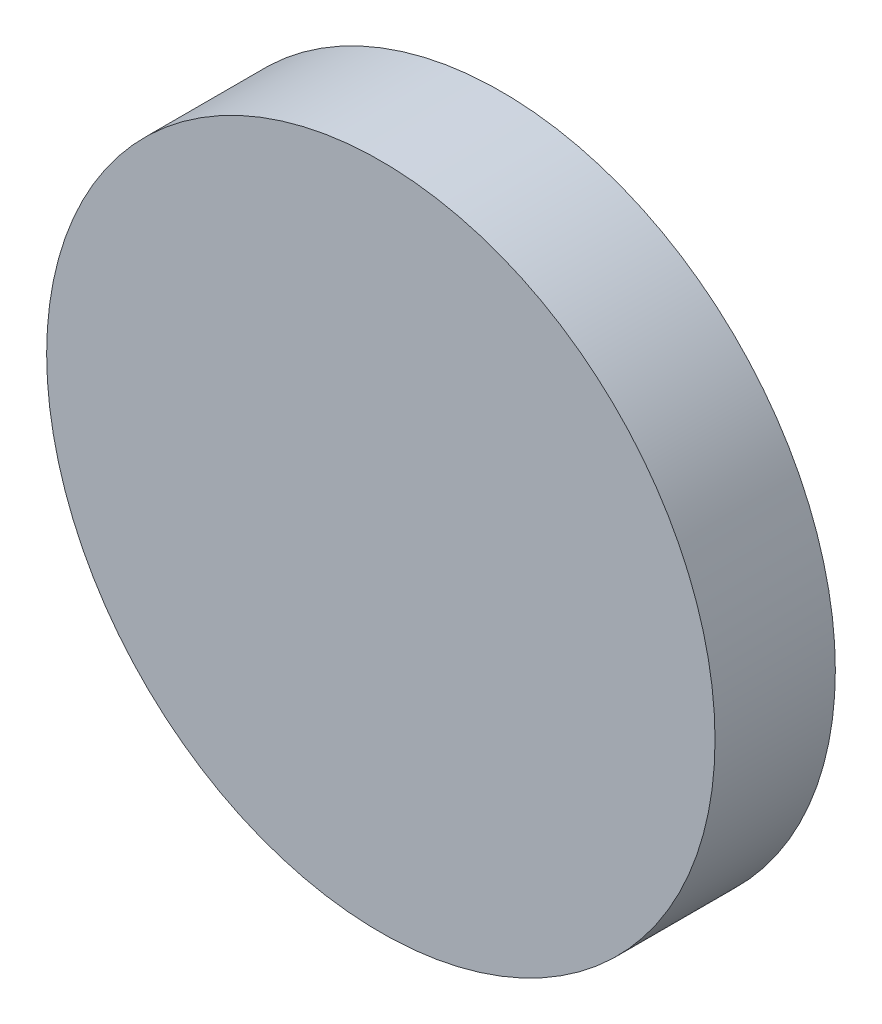
ISO-10303-21;
HEADER;
FILE_DESCRIPTION(('STEP AP214'),'2;1');
FILE_NAME('part.step','',(''),(''),'','','');
FILE_SCHEMA(('AUTOMOTIVE_DESIGN { 1 0 10303 214 1 1 1 1 }'));
ENDSEC;
DATA;
#1=APPLICATION_CONTEXT('core data for automotive mechanical design processes');
#2=APPLICATION_PROTOCOL_DEFINITION('international standard','automotive_design',2000,#1);
#3=PRODUCT_CONTEXT('',#1,'mechanical');
#4=PRODUCT('Part','Part','',(#3));
#5=PRODUCT_RELATED_PRODUCT_CATEGORY('part','',(#4));
#6=PRODUCT_DEFINITION_FORMATION('','',#4);
#7=PRODUCT_DEFINITION_CONTEXT('part definition',#1,'design');
#8=PRODUCT_DEFINITION('design','',#6,#7);
#9=PRODUCT_DEFINITION_SHAPE('','',#8);
#10=(LENGTH_UNIT() NAMED_UNIT(*) SI_UNIT(.MILLI.,.METRE.));
#11=(NAMED_UNIT(*) PLANE_ANGLE_UNIT() SI_UNIT($,.RADIAN.));
#12=(NAMED_UNIT(*) SI_UNIT($,.STERADIAN.) SOLID_ANGLE_UNIT());
#13=UNCERTAINTY_MEASURE_WITH_UNIT(LENGTH_MEASURE(1.E-05),#10,'distance_accuracy_value','');
#14=(GEOMETRIC_REPRESENTATION_CONTEXT(3) GLOBAL_UNCERTAINTY_ASSIGNED_CONTEXT((#13)) GLOBAL_UNIT_ASSIGNED_CONTEXT((#10,
#11,#12)) REPRESENTATION_CONTEXT('',''));
#15=CARTESIAN_POINT('',(0.,0.,0.));
#16=DIRECTION('',(0.,0.,1.));
#17=DIRECTION('',(1.,0.,0.));
#18=AXIS2_PLACEMENT_3D('',#15,#16,#17);
#19=CARTESIAN_POINT('',(0.,0.,33.));
#20=DIRECTION('',(0.,0.,-1.));
#21=DIRECTION('',(-1.,0.,0.));
#22=AXIS2_PLACEMENT_3D('',#19,#20,#21);
#23=CYLINDRICAL_SURFACE('',#22,97.);
#24=CARTESIAN_POINT('',(0.,0.,33.));
#25=DIRECTION('',(0.,0.,1.));
#26=DIRECTION('',(1.,0.,0.));
#27=AXIS2_PLACEMENT_3D('',#24,#25,#26);
#28=CIRCLE('',#27,97.);
#29=CARTESIAN_POINT('',(97.,0.,33.));
#30=VERTEX_POINT('',#29);
#31=EDGE_CURVE('E123',#30,#30,#28,.T.);
#32=ORIENTED_EDGE('',*,*,#31,.T.);
#33=EDGE_LOOP('',(#32));
#34=FACE_BOUND('',#33,.T.);
#35=CARTESIAN_POINT('',(0.,0.,0.));
#36=DIRECTION('',(0.,0.,1.));
#37=DIRECTION('',(1.,0.,0.));
#38=AXIS2_PLACEMENT_3D('',#35,#36,#37);
#39=CIRCLE('',#38,97.);
#40=CARTESIAN_POINT('',(-96.7470929795826,-7.,0.));
#41=VERTEX_POINT('',#40);
#42=CARTESIAN_POINT('',(-96.7470929795826,7.,0.));
#43=VERTEX_POINT('',#42);
#44=EDGE_CURVE('E102',#41,#43,#39,.T.);
#45=ORIENTED_EDGE('',*,*,#44,.F.);
#46=DIRECTION('',(0.,0.,-1.));
#47=VECTOR('',#46,1.);
#48=CARTESIAN_POINT('',(-96.7470929795826,-7.,33.));
#49=LINE('',#48,#47);
#50=CARTESIAN_POINT('',(-96.7470929795826,-7.,4.));
#51=VERTEX_POINT('',#50);
#52=EDGE_CURVE('E11',#41,#51,#49,.F.);
#53=ORIENTED_EDGE('',*,*,#52,.T.);
#54=CARTESIAN_POINT('',(0.,0.,4.));
#55=DIRECTION('',(0.,0.,-1.));
#56=DIRECTION('',(-1.,0.,0.));
#57=AXIS2_PLACEMENT_3D('',#54,#55,#56);
#58=CIRCLE('',#57,97.);
#59=CARTESIAN_POINT('',(-96.7470929795826,7.,4.));
#60=VERTEX_POINT('',#59);
#61=EDGE_CURVE('E67',#51,#60,#58,.T.);
#62=ORIENTED_EDGE('',*,*,#61,.T.);
#63=DIRECTION('',(0.,0.,-1.));
#64=VECTOR('',#63,1.);
#65=CARTESIAN_POINT('',(-96.7470929795826,7.,33.));
#66=LINE('',#65,#64);
#67=EDGE_CURVE('E53',#60,#43,#66,.T.);
#68=ORIENTED_EDGE('',*,*,#67,.T.);
#69=EDGE_LOOP('',(#45,#53,#62,#68));
#70=FACE_BOUND('',#69,.T.);
#71=ADVANCED_FACE('F44',(#34,#70),#23,.F.);
#72=CARTESIAN_POINT('',(0.,0.,36.));
#73=DIRECTION('',(0.,0.,-1.));
#74=DIRECTION('',(-1.,0.,0.));
#75=AXIS2_PLACEMENT_3D('',#72,#73,#74);
#76=CYLINDRICAL_SURFACE('',#75,100.);
#77=CARTESIAN_POINT('',(0.,0.,36.));
#78=DIRECTION('',(0.,0.,1.));
#79=DIRECTION('',(1.,0.,0.));
#80=AXIS2_PLACEMENT_3D('',#77,#78,#79);
#81=CIRCLE('',#80,100.);
#82=CARTESIAN_POINT('',(100.,0.,36.));
#83=VERTEX_POINT('',#82);
#84=EDGE_CURVE('E135',#83,#83,#81,.T.);
#85=ORIENTED_EDGE('',*,*,#84,.F.);
#86=EDGE_LOOP('',(#85));
#87=FACE_BOUND('',#86,.T.);
#88=CARTESIAN_POINT('',(0.,0.,0.));
#89=DIRECTION('',(0.,0.,1.));
#90=DIRECTION('',(1.,0.,0.));
#91=AXIS2_PLACEMENT_3D('',#88,#89,#90);
#92=CIRCLE('',#91,100.);
#93=CARTESIAN_POINT('',(100.,0.,0.));
#94=VERTEX_POINT('',#93);
#95=EDGE_CURVE('E129',#94,#94,#92,.T.);
#96=ORIENTED_EDGE('',*,*,#95,.T.);
#97=EDGE_LOOP('',(#96));
#98=FACE_BOUND('',#97,.T.);
#99=ADVANCED_FACE('F50',(#87,#98),#76,.T.);
#100=CARTESIAN_POINT('',(0.,0.,36.));
#101=DIRECTION('',(0.,0.,1.));
#102=DIRECTION('',(1.,0.,0.));
#103=AXIS2_PLACEMENT_3D('',#100,#101,#102);
#104=PLANE('',#103);
#105=ORIENTED_EDGE('',*,*,#84,.T.);
#106=EDGE_LOOP('',(#105));
#107=FACE_BOUND('',#106,.T.);
#108=ADVANCED_FACE('F159',(#107),#104,.T.);
#109=CARTESIAN_POINT('',(0.,0.,0.));
#110=DIRECTION('',(0.,0.,1.));
#111=DIRECTION('',(1.,0.,0.));
#112=AXIS2_PLACEMENT_3D('',#109,#110,#111);
#113=PLANE('',#112);
#114=ORIENTED_EDGE('',*,*,#44,.T.);
#115=DIRECTION('',(-1.,0.,0.));
#116=VECTOR('',#115,1.);
#117=CARTESIAN_POINT('',(-98.,7.,0.));
#118=LINE('',#117,#116);
#119=CARTESIAN_POINT('',(-98.,7.,0.));
#120=VERTEX_POINT('',#119);
#121=EDGE_CURVE('E90',#43,#120,#118,.T.);
#122=ORIENTED_EDGE('',*,*,#121,.T.);
#123=DIRECTION('',(0.,-1.,0.));
#124=VECTOR('',#123,1.);
#125=CARTESIAN_POINT('',(-98.,-7.,0.));
#126=LINE('',#125,#124);
#127=CARTESIAN_POINT('',(-98.,-7.,0.));
#128=VERTEX_POINT('',#127);
#129=EDGE_CURVE('E98',#120,#128,#126,.T.);
#130=ORIENTED_EDGE('',*,*,#129,.T.);
#131=DIRECTION('',(1.,0.,0.));
#132=VECTOR('',#131,1.);
#133=CARTESIAN_POINT('',(-98.,-7.,0.));
#134=LINE('',#133,#132);
#135=EDGE_CURVE('E104',#128,#41,#134,.T.);
#136=ORIENTED_EDGE('',*,*,#135,.T.);
#137=EDGE_LOOP('',(#114,#122,#130,#136));
#138=FACE_BOUND('',#137,.T.);
#139=ORIENTED_EDGE('',*,*,#95,.F.);
#140=EDGE_LOOP('',(#139));
#141=FACE_BOUND('',#140,.T.);
#142=ADVANCED_FACE('F107',(#138,#141),#113,.F.);
#143=CARTESIAN_POINT('',(0.,0.,33.));
#144=DIRECTION('',(0.,0.,1.));
#145=DIRECTION('',(1.,0.,0.));
#146=AXIS2_PLACEMENT_3D('',#143,#144,#145);
#147=PLANE('',#146);
#148=ORIENTED_EDGE('',*,*,#31,.F.);
#149=EDGE_LOOP('',(#148));
#150=FACE_BOUND('',#149,.T.);
#151=ADVANCED_FACE('F162',(#150),#147,.F.);
#152=CARTESIAN_POINT('',(-98.,-7.,4.));
#153=DIRECTION('',(1.,0.,0.));
#154=DIRECTION('',(0.,0.,-1.));
#155=AXIS2_PLACEMENT_3D('',#152,#153,#154);
#156=PLANE('',#155);
#157=ORIENTED_EDGE('',*,*,#129,.F.);
#158=DIRECTION('',(0.,0.,-1.));
#159=VECTOR('',#158,1.);
#160=CARTESIAN_POINT('',(-98.,7.,4.));
#161=LINE('',#160,#159);
#162=CARTESIAN_POINT('',(-98.,7.,4.));
#163=VERTEX_POINT('',#162);
#164=EDGE_CURVE('E83',#163,#120,#161,.T.);
#165=ORIENTED_EDGE('',*,*,#164,.F.);
#166=DIRECTION('',(0.,-1.,0.));
#167=VECTOR('',#166,1.);
#168=CARTESIAN_POINT('',(-98.,-7.,4.));
#169=LINE('',#168,#167);
#170=CARTESIAN_POINT('',(-98.,-7.,4.));
#171=VERTEX_POINT('',#170);
#172=EDGE_CURVE('E115',#163,#171,#169,.T.);
#173=ORIENTED_EDGE('',*,*,#172,.T.);
#174=DIRECTION('',(0.,0.,-1.));
#175=VECTOR('',#174,1.);
#176=CARTESIAN_POINT('',(-98.,-7.,4.));
#177=LINE('',#176,#175);
#178=EDGE_CURVE('E94',#171,#128,#177,.T.);
#179=ORIENTED_EDGE('',*,*,#178,.T.);
#180=EDGE_LOOP('',(#157,#165,#173,#179));
#181=FACE_BOUND('',#180,.T.);
#182=ADVANCED_FACE('F97',(#181),#156,.T.);
#183=CARTESIAN_POINT('',(-98.,-7.,4.));
#184=DIRECTION('',(0.,1.,0.));
#185=DIRECTION('',(0.,0.,1.));
#186=AXIS2_PLACEMENT_3D('',#183,#184,#185);
#187=PLANE('',#186);
#188=ORIENTED_EDGE('',*,*,#135,.F.);
#189=ORIENTED_EDGE('',*,*,#178,.F.);
#190=DIRECTION('',(1.,0.,0.));
#191=VECTOR('',#190,1.);
#192=CARTESIAN_POINT('',(-98.,-7.,4.));
#193=LINE('',#192,#191);
#194=EDGE_CURVE('E116',#171,#51,#193,.T.);
#195=ORIENTED_EDGE('',*,*,#194,.T.);
#196=ORIENTED_EDGE('',*,*,#52,.F.);
#197=EDGE_LOOP('',(#188,#189,#195,#196));
#198=FACE_BOUND('',#197,.T.);
#199=ADVANCED_FACE('F141',(#198),#187,.T.);
#200=CARTESIAN_POINT('',(-98.,7.,4.));
#201=DIRECTION('',(0.,-1.,0.));
#202=DIRECTION('',(0.,0.,-1.));
#203=AXIS2_PLACEMENT_3D('',#200,#201,#202);
#204=PLANE('',#203);
#205=DIRECTION('',(-1.,0.,0.));
#206=VECTOR('',#205,1.);
#207=CARTESIAN_POINT('',(-98.,7.,4.));
#208=LINE('',#207,#206);
#209=EDGE_CURVE('E64',#60,#163,#208,.T.);
#210=ORIENTED_EDGE('',*,*,#209,.T.);
#211=ORIENTED_EDGE('',*,*,#164,.T.);
#212=ORIENTED_EDGE('',*,*,#121,.F.);
#213=ORIENTED_EDGE('',*,*,#67,.F.);
#214=EDGE_LOOP('',(#210,#211,#212,#213));
#215=FACE_BOUND('',#214,.T.);
#216=ADVANCED_FACE('F87',(#215),#204,.T.);
#217=CARTESIAN_POINT('',(0.,0.,4.));
#218=DIRECTION('',(0.,0.,-1.));
#219=DIRECTION('',(-1.,0.,0.));
#220=AXIS2_PLACEMENT_3D('',#217,#218,#219);
#221=PLANE('',#220);
#222=ORIENTED_EDGE('',*,*,#194,.F.);
#223=ORIENTED_EDGE('',*,*,#172,.F.);
#224=ORIENTED_EDGE('',*,*,#209,.F.);
#225=ORIENTED_EDGE('',*,*,#61,.F.);
#226=EDGE_LOOP('',(#222,#223,#224,#225));
#227=FACE_BOUND('',#226,.T.);
#228=ADVANCED_FACE('F145',(#227),#221,.T.);
#229=CLOSED_SHELL('',(#71,#99,#108,#142,#151,#182,#199,#216,#228));
#230=MANIFOLD_SOLID_BREP('B2',#229);
#231=ADVANCED_BREP_SHAPE_REPRESENTATION('',(#18,#230),#14);
#232=SHAPE_DEFINITION_REPRESENTATION(#9,#231);
ENDSEC;
END-ISO-10303-21;
